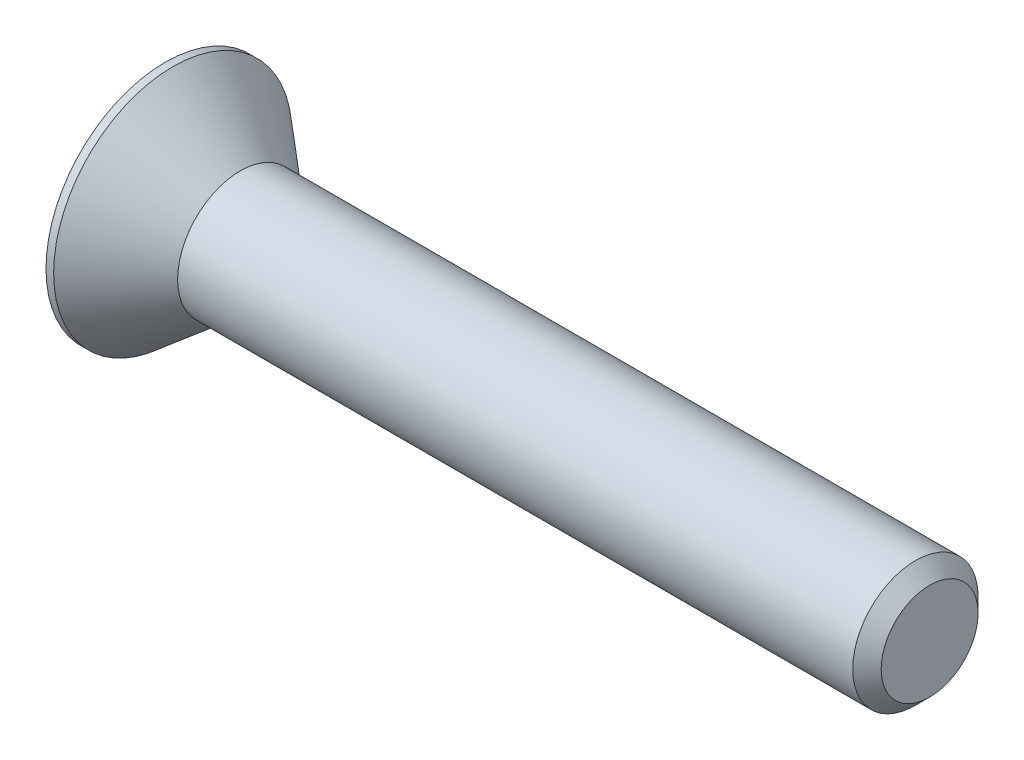
ISO-10303-21;
HEADER;
FILE_DESCRIPTION(('STEP AP214'),'2;1');
FILE_NAME('part.step','',(''),(''),'','','');
FILE_SCHEMA(('AUTOMOTIVE_DESIGN { 1 0 10303 214 1 1 1 1 }'));
ENDSEC;
DATA;
#1=APPLICATION_CONTEXT('core data for automotive mechanical design processes');
#2=APPLICATION_PROTOCOL_DEFINITION('international standard','automotive_design',2000,#1);
#3=PRODUCT_CONTEXT('',#1,'mechanical');
#4=PRODUCT('Part','Part','',(#3));
#5=PRODUCT_RELATED_PRODUCT_CATEGORY('part','',(#4));
#6=PRODUCT_DEFINITION_FORMATION('','',#4);
#7=PRODUCT_DEFINITION_CONTEXT('part definition',#1,'design');
#8=PRODUCT_DEFINITION('design','',#6,#7);
#9=PRODUCT_DEFINITION_SHAPE('','',#8);
#10=(LENGTH_UNIT() NAMED_UNIT(*) SI_UNIT(.MILLI.,.METRE.));
#11=(NAMED_UNIT(*) PLANE_ANGLE_UNIT() SI_UNIT($,.RADIAN.));
#12=(NAMED_UNIT(*) SI_UNIT($,.STERADIAN.) SOLID_ANGLE_UNIT());
#13=UNCERTAINTY_MEASURE_WITH_UNIT(LENGTH_MEASURE(1.E-05),#10,'distance_accuracy_value','');
#14=(GEOMETRIC_REPRESENTATION_CONTEXT(3) GLOBAL_UNCERTAINTY_ASSIGNED_CONTEXT((#13)) GLOBAL_UNIT_ASSIGNED_CONTEXT((#10,
#11,#12)) REPRESENTATION_CONTEXT('',''));
#15=CARTESIAN_POINT('',(0.,0.,0.));
#16=DIRECTION('',(0.,0.,1.));
#17=DIRECTION('',(1.,0.,0.));
#18=AXIS2_PLACEMENT_3D('',#15,#16,#17);
#19=CARTESIAN_POINT('',(-1.65136592745077,0.,2.3114));
#20=DIRECTION('',(0.,0.,1.));
#21=DIRECTION('',(1.,0.,0.));
#22=AXIS2_PLACEMENT_3D('',#19,#20,#21);
#23=PLANE('',#22);
#24=DIRECTION('',(1.,0.,0.));
#25=VECTOR('',#24,1.);
#26=CARTESIAN_POINT('',(-1.65136592745077,-0.381,2.3114));
#27=LINE('',#26,#25);
#28=CARTESIAN_POINT('',(-2.54,-0.381,2.3114));
#29=VERTEX_POINT('',#28);
#30=CARTESIAN_POINT('',(-0.76273185490154,-0.381,2.3114));
#31=VERTEX_POINT('',#30);
#32=EDGE_CURVE('E121',#29,#31,#27,.T.);
#33=ORIENTED_EDGE('',*,*,#32,.F.);
#34=DIRECTION('',(0.,1.,0.));
#35=VECTOR('',#34,1.);
#36=CARTESIAN_POINT('',(-2.54,0.,2.3114));
#37=LINE('',#36,#35);
#38=CARTESIAN_POINT('',(-2.54,0.381,2.3114));
#39=VERTEX_POINT('',#38);
#40=EDGE_CURVE('E118',#39,#29,#37,.F.);
#41=ORIENTED_EDGE('',*,*,#40,.F.);
#42=DIRECTION('',(1.,0.,0.));
#43=VECTOR('',#42,1.);
#44=CARTESIAN_POINT('',(-1.65136592745077,0.381,2.3114));
#45=LINE('',#44,#43);
#46=CARTESIAN_POINT('',(-0.76273185490154,0.381,2.3114));
#47=VERTEX_POINT('',#46);
#48=EDGE_CURVE('E117',#47,#39,#45,.F.);
#49=ORIENTED_EDGE('',*,*,#48,.F.);
#50=DIRECTION('',(0.,1.,0.));
#51=VECTOR('',#50,1.);
#52=CARTESIAN_POINT('',(-0.76273185490154,0.,2.3114));
#53=LINE('',#52,#51);
#54=EDGE_CURVE('E103',#31,#47,#53,.T.);
#55=ORIENTED_EDGE('',*,*,#54,.F.);
#56=EDGE_LOOP('',(#33,#41,#49,#55));
#57=FACE_BOUND('',#56,.T.);
#58=ADVANCED_FACE('F16',(#57),#23,.F.);
#59=CARTESIAN_POINT('',(-1.65136592745077,-2.3114,0.));
#60=DIRECTION('',(0.,1.,0.));
#61=DIRECTION('',(0.,0.,1.));
#62=AXIS2_PLACEMENT_3D('',#59,#60,#61);
#63=PLANE('',#62);
#64=DIRECTION('',(0.,0.,1.));
#65=VECTOR('',#64,1.);
#66=CARTESIAN_POINT('',(-0.76273185490154,-2.3114,0.));
#67=LINE('',#66,#65);
#68=CARTESIAN_POINT('',(-0.76273185490154,-2.3114,-0.381));
#69=VERTEX_POINT('',#68);
#70=CARTESIAN_POINT('',(-0.76273185490154,-2.3114,0.381));
#71=VERTEX_POINT('',#70);
#72=EDGE_CURVE('E114',#69,#71,#67,.T.);
#73=ORIENTED_EDGE('',*,*,#72,.F.);
#74=DIRECTION('',(1.,0.,0.));
#75=VECTOR('',#74,1.);
#76=CARTESIAN_POINT('',(-1.65136592745077,-2.3114,-0.381));
#77=LINE('',#76,#75);
#78=CARTESIAN_POINT('',(-2.54,-2.3114,-0.381));
#79=VERTEX_POINT('',#78);
#80=EDGE_CURVE('E209',#79,#69,#77,.T.);
#81=ORIENTED_EDGE('',*,*,#80,.F.);
#82=DIRECTION('',(0.,0.,1.));
#83=VECTOR('',#82,1.);
#84=CARTESIAN_POINT('',(-2.54,-2.3114,0.));
#85=LINE('',#84,#83);
#86=CARTESIAN_POINT('',(-2.54,-2.3114,0.381));
#87=VERTEX_POINT('',#86);
#88=EDGE_CURVE('E139',#79,#87,#85,.T.);
#89=ORIENTED_EDGE('',*,*,#88,.T.);
#90=DIRECTION('',(1.,0.,0.));
#91=VECTOR('',#90,1.);
#92=CARTESIAN_POINT('',(-1.65136592745077,-2.3114,0.381));
#93=LINE('',#92,#91);
#94=EDGE_CURVE('E216',#87,#71,#93,.T.);
#95=ORIENTED_EDGE('',*,*,#94,.T.);
#96=EDGE_LOOP('',(#73,#81,#89,#95));
#97=FACE_BOUND('',#96,.T.);
#98=ADVANCED_FACE('F255',(#97),#63,.T.);
#99=CARTESIAN_POINT('',(-1.65136592745077,0.,-2.3114));
#100=DIRECTION('',(0.,0.,1.));
#101=DIRECTION('',(1.,0.,0.));
#102=AXIS2_PLACEMENT_3D('',#99,#100,#101);
#103=PLANE('',#102);
#104=DIRECTION('',(0.,1.,0.));
#105=VECTOR('',#104,1.);
#106=CARTESIAN_POINT('',(-2.54,0.,-2.3114));
#107=LINE('',#106,#105);
#108=CARTESIAN_POINT('',(-2.54,0.381,-2.3114));
#109=VERTEX_POINT('',#108);
#110=CARTESIAN_POINT('',(-2.54,-0.381,-2.3114));
#111=VERTEX_POINT('',#110);
#112=EDGE_CURVE('E137',#109,#111,#107,.F.);
#113=ORIENTED_EDGE('',*,*,#112,.T.);
#114=DIRECTION('',(1.,0.,0.));
#115=VECTOR('',#114,1.);
#116=CARTESIAN_POINT('',(-1.65136592745077,-0.381,-2.3114));
#117=LINE('',#116,#115);
#118=CARTESIAN_POINT('',(-0.76273185490154,-0.381,-2.3114));
#119=VERTEX_POINT('',#118);
#120=EDGE_CURVE('E198',#119,#111,#117,.F.);
#121=ORIENTED_EDGE('',*,*,#120,.F.);
#122=DIRECTION('',(0.,1.,0.));
#123=VECTOR('',#122,1.);
#124=CARTESIAN_POINT('',(-0.76273185490154,0.,-2.3114));
#125=LINE('',#124,#123);
#126=CARTESIAN_POINT('',(-0.76273185490154,0.381,-2.3114));
#127=VERTEX_POINT('',#126);
#128=EDGE_CURVE('E135',#127,#119,#125,.F.);
#129=ORIENTED_EDGE('',*,*,#128,.F.);
#130=DIRECTION('',(1.,0.,0.));
#131=VECTOR('',#130,1.);
#132=CARTESIAN_POINT('',(-1.65136592745077,0.381,-2.3114));
#133=LINE('',#132,#131);
#134=EDGE_CURVE('E195',#109,#127,#133,.T.);
#135=ORIENTED_EDGE('',*,*,#134,.F.);
#136=EDGE_LOOP('',(#113,#121,#129,#135));
#137=FACE_BOUND('',#136,.T.);
#138=ADVANCED_FACE('F244',(#137),#103,.T.);
#139=CARTESIAN_POINT('',(-0.76273185490154,0.,0.));
#140=DIRECTION('',(-1.,0.,0.));
#141=DIRECTION('',(0.,0.,1.));
#142=AXIS2_PLACEMENT_3D('',#139,#140,#141);
#143=PLANE('',#142);
#144=ORIENTED_EDGE('',*,*,#54,.T.);
#145=DIRECTION('',(0.,0.,-1.));
#146=VECTOR('',#145,1.);
#147=CARTESIAN_POINT('',(-0.76273185490154,0.381,0.));
#148=LINE('',#147,#146);
#149=CARTESIAN_POINT('',(-0.76273185490154,0.381,0.381));
#150=VERTEX_POINT('',#149);
#151=EDGE_CURVE('E108',#150,#47,#148,.F.);
#152=ORIENTED_EDGE('',*,*,#151,.F.);
#153=DIRECTION('',(0.,1.,0.));
#154=VECTOR('',#153,1.);
#155=CARTESIAN_POINT('',(-0.76273185490154,0.,0.381));
#156=LINE('',#155,#154);
#157=CARTESIAN_POINT('',(-0.76273185490154,2.3114,0.381));
#158=VERTEX_POINT('',#157);
#159=EDGE_CURVE('E182',#150,#158,#156,.T.);
#160=ORIENTED_EDGE('',*,*,#159,.T.);
#161=DIRECTION('',(0.,0.,-1.));
#162=VECTOR('',#161,1.);
#163=CARTESIAN_POINT('',(-0.76273185490154,2.3114,0.));
#164=LINE('',#163,#162);
#165=CARTESIAN_POINT('',(-0.76273185490154,2.3114,-0.381));
#166=VERTEX_POINT('',#165);
#167=EDGE_CURVE('E113',#166,#158,#164,.F.);
#168=ORIENTED_EDGE('',*,*,#167,.F.);
#169=DIRECTION('',(0.,1.,0.));
#170=VECTOR('',#169,1.);
#171=CARTESIAN_POINT('',(-0.76273185490154,0.,-0.381));
#172=LINE('',#171,#170);
#173=CARTESIAN_POINT('',(-0.76273185490154,0.381,-0.381));
#174=VERTEX_POINT('',#173);
#175=EDGE_CURVE('E187',#174,#166,#172,.T.);
#176=ORIENTED_EDGE('',*,*,#175,.F.);
#177=DIRECTION('',(0.,0.,-1.));
#178=VECTOR('',#177,1.);
#179=CARTESIAN_POINT('',(-0.76273185490154,0.381,0.));
#180=LINE('',#179,#178);
#181=EDGE_CURVE('E193',#127,#174,#180,.F.);
#182=ORIENTED_EDGE('',*,*,#181,.F.);
#183=ORIENTED_EDGE('',*,*,#128,.T.);
#184=DIRECTION('',(0.,0.,1.));
#185=VECTOR('',#184,1.);
#186=CARTESIAN_POINT('',(-0.76273185490154,-0.381,0.));
#187=LINE('',#186,#185);
#188=CARTESIAN_POINT('',(-0.76273185490154,-0.381,-0.381));
#189=VERTEX_POINT('',#188);
#190=EDGE_CURVE('E201',#189,#119,#187,.F.);
#191=ORIENTED_EDGE('',*,*,#190,.F.);
#192=DIRECTION('',(0.,1.,0.));
#193=VECTOR('',#192,1.);
#194=CARTESIAN_POINT('',(-0.76273185490154,0.,-0.381));
#195=LINE('',#194,#193);
#196=EDGE_CURVE('E207',#69,#189,#195,.T.);
#197=ORIENTED_EDGE('',*,*,#196,.F.);
#198=ORIENTED_EDGE('',*,*,#72,.T.);
#199=DIRECTION('',(0.,1.,0.));
#200=VECTOR('',#199,1.);
#201=CARTESIAN_POINT('',(-0.76273185490154,0.,0.381));
#202=LINE('',#201,#200);
#203=CARTESIAN_POINT('',(-0.76273185490154,-0.381,0.381));
#204=VERTEX_POINT('',#203);
#205=EDGE_CURVE('E214',#71,#204,#202,.T.);
#206=ORIENTED_EDGE('',*,*,#205,.T.);
#207=DIRECTION('',(0.,0.,1.));
#208=VECTOR('',#207,1.);
#209=CARTESIAN_POINT('',(-0.76273185490154,-0.381,0.));
#210=LINE('',#209,#208);
#211=EDGE_CURVE('E111',#31,#204,#210,.F.);
#212=ORIENTED_EDGE('',*,*,#211,.F.);
#213=EDGE_LOOP('',(#144,#152,#160,#168,#176,#182,#183,#191,#197,#198,#206,#212));
#214=FACE_BOUND('',#213,.T.);
#215=ADVANCED_FACE('F106',(#214),#143,.T.);
#216=CARTESIAN_POINT('',(-1.65136592745077,2.3114,0.));
#217=DIRECTION('',(0.,-1.,0.));
#218=DIRECTION('',(0.,0.,-1.));
#219=AXIS2_PLACEMENT_3D('',#216,#217,#218);
#220=PLANE('',#219);
#221=DIRECTION('',(0.,0.,-1.));
#222=VECTOR('',#221,1.);
#223=CARTESIAN_POINT('',(-2.54,2.3114,0.));
#224=LINE('',#223,#222);
#225=CARTESIAN_POINT('',(-2.54,2.3114,0.381));
#226=VERTEX_POINT('',#225);
#227=CARTESIAN_POINT('',(-2.54,2.3114,-0.381));
#228=VERTEX_POINT('',#227);
#229=EDGE_CURVE('E34',#226,#228,#224,.T.);
#230=ORIENTED_EDGE('',*,*,#229,.T.);
#231=DIRECTION('',(1.,0.,0.));
#232=VECTOR('',#231,1.);
#233=CARTESIAN_POINT('',(-1.65136592745077,2.3114,-0.381));
#234=LINE('',#233,#232);
#235=EDGE_CURVE('E184',#166,#228,#234,.F.);
#236=ORIENTED_EDGE('',*,*,#235,.F.);
#237=ORIENTED_EDGE('',*,*,#167,.T.);
#238=DIRECTION('',(1.,0.,0.));
#239=VECTOR('',#238,1.);
#240=CARTESIAN_POINT('',(-1.65136592745077,2.3114,0.381));
#241=LINE('',#240,#239);
#242=EDGE_CURVE('E180',#158,#226,#241,.F.);
#243=ORIENTED_EDGE('',*,*,#242,.T.);
#244=EDGE_LOOP('',(#230,#236,#237,#243));
#245=FACE_BOUND('',#244,.T.);
#246=ADVANCED_FACE('F232',(#245),#220,.T.);
#247=CARTESIAN_POINT('',(-1.65136592745077,0.381,0.));
#248=DIRECTION('',(0.,-1.,0.));
#249=DIRECTION('',(0.,0.,-1.));
#250=AXIS2_PLACEMENT_3D('',#247,#248,#249);
#251=PLANE('',#250);
#252=ORIENTED_EDGE('',*,*,#48,.T.);
#253=DIRECTION('',(0.,0.,1.));
#254=VECTOR('',#253,1.);
#255=CARTESIAN_POINT('',(-2.54,0.381,1.9812));
#256=LINE('',#255,#254);
#257=CARTESIAN_POINT('',(-2.54,0.381,0.381));
#258=VERTEX_POINT('',#257);
#259=EDGE_CURVE('E177',#258,#39,#256,.T.);
#260=ORIENTED_EDGE('',*,*,#259,.F.);
#261=DIRECTION('',(1.,0.,0.));
#262=VECTOR('',#261,1.);
#263=CARTESIAN_POINT('',(-1.65136592745077,0.381,0.381));
#264=LINE('',#263,#262);
#265=EDGE_CURVE('E125',#258,#150,#264,.T.);
#266=ORIENTED_EDGE('',*,*,#265,.T.);
#267=ORIENTED_EDGE('',*,*,#151,.T.);
#268=EDGE_LOOP('',(#252,#260,#266,#267));
#269=FACE_BOUND('',#268,.T.);
#270=ADVANCED_FACE('F123',(#269),#251,.T.);
#271=CARTESIAN_POINT('',(-1.65136592745077,-0.381,0.));
#272=DIRECTION('',(0.,1.,0.));
#273=DIRECTION('',(0.,0.,1.));
#274=AXIS2_PLACEMENT_3D('',#271,#272,#273);
#275=PLANE('',#274);
#276=ORIENTED_EDGE('',*,*,#32,.T.);
#277=ORIENTED_EDGE('',*,*,#211,.T.);
#278=DIRECTION('',(1.,0.,0.));
#279=VECTOR('',#278,1.);
#280=CARTESIAN_POINT('',(-1.65136592745077,-0.381,0.381));
#281=LINE('',#280,#279);
#282=CARTESIAN_POINT('',(-2.54,-0.381,0.381));
#283=VERTEX_POINT('',#282);
#284=EDGE_CURVE('E212',#204,#283,#281,.F.);
#285=ORIENTED_EDGE('',*,*,#284,.T.);
#286=DIRECTION('',(0.,0.,1.));
#287=VECTOR('',#286,1.);
#288=CARTESIAN_POINT('',(-2.54,-0.381,1.9812));
#289=LINE('',#288,#287);
#290=EDGE_CURVE('E174',#29,#283,#289,.F.);
#291=ORIENTED_EDGE('',*,*,#290,.F.);
#292=EDGE_LOOP('',(#276,#277,#285,#291));
#293=FACE_BOUND('',#292,.T.);
#294=ADVANCED_FACE('F220',(#293),#275,.T.);
#295=CARTESIAN_POINT('',(-1.65136592745077,0.,0.381));
#296=DIRECTION('',(0.,0.,1.));
#297=DIRECTION('',(1.,0.,0.));
#298=AXIS2_PLACEMENT_3D('',#295,#296,#297);
#299=PLANE('',#298);
#300=ORIENTED_EDGE('',*,*,#205,.F.);
#301=ORIENTED_EDGE('',*,*,#94,.F.);
#302=DIRECTION('',(0.,1.,0.));
#303=VECTOR('',#302,1.);
#304=CARTESIAN_POINT('',(-2.54,0.,0.381));
#305=LINE('',#304,#303);
#306=EDGE_CURVE('E171',#283,#87,#305,.F.);
#307=ORIENTED_EDGE('',*,*,#306,.F.);
#308=ORIENTED_EDGE('',*,*,#284,.F.);
#309=EDGE_LOOP('',(#300,#301,#307,#308));
#310=FACE_BOUND('',#309,.T.);
#311=ADVANCED_FACE('F258',(#310),#299,.F.);
#312=CARTESIAN_POINT('',(-1.65136592745077,0.,-0.381));
#313=DIRECTION('',(0.,0.,1.));
#314=DIRECTION('',(1.,0.,0.));
#315=AXIS2_PLACEMENT_3D('',#312,#313,#314);
#316=PLANE('',#315);
#317=ORIENTED_EDGE('',*,*,#80,.T.);
#318=ORIENTED_EDGE('',*,*,#196,.T.);
#319=DIRECTION('',(1.,0.,0.));
#320=VECTOR('',#319,1.);
#321=CARTESIAN_POINT('',(-1.65136592745077,-0.381,-0.381));
#322=LINE('',#321,#320);
#323=CARTESIAN_POINT('',(-2.54,-0.381,-0.381));
#324=VERTEX_POINT('',#323);
#325=EDGE_CURVE('E204',#324,#189,#322,.T.);
#326=ORIENTED_EDGE('',*,*,#325,.F.);
#327=DIRECTION('',(0.,1.,0.));
#328=VECTOR('',#327,1.);
#329=CARTESIAN_POINT('',(-2.54,0.,-0.381));
#330=LINE('',#329,#328);
#331=EDGE_CURVE('E168',#79,#324,#330,.T.);
#332=ORIENTED_EDGE('',*,*,#331,.F.);
#333=EDGE_LOOP('',(#317,#318,#326,#332));
#334=FACE_BOUND('',#333,.T.);
#335=ADVANCED_FACE('F253',(#334),#316,.T.);
#336=CARTESIAN_POINT('',(-1.65136592745077,-0.381,0.));
#337=DIRECTION('',(0.,1.,0.));
#338=DIRECTION('',(0.,0.,1.));
#339=AXIS2_PLACEMENT_3D('',#336,#337,#338);
#340=PLANE('',#339);
#341=ORIENTED_EDGE('',*,*,#120,.T.);
#342=DIRECTION('',(0.,0.,1.));
#343=VECTOR('',#342,1.);
#344=CARTESIAN_POINT('',(-2.54,-0.381,1.9812));
#345=LINE('',#344,#343);
#346=EDGE_CURVE('E165',#324,#111,#345,.F.);
#347=ORIENTED_EDGE('',*,*,#346,.F.);
#348=ORIENTED_EDGE('',*,*,#325,.T.);
#349=ORIENTED_EDGE('',*,*,#190,.T.);
#350=EDGE_LOOP('',(#341,#347,#348,#349));
#351=FACE_BOUND('',#350,.T.);
#352=ADVANCED_FACE('F247',(#351),#340,.T.);
#353=CARTESIAN_POINT('',(-1.65136592745077,0.381,0.));
#354=DIRECTION('',(0.,-1.,0.));
#355=DIRECTION('',(0.,0.,-1.));
#356=AXIS2_PLACEMENT_3D('',#353,#354,#355);
#357=PLANE('',#356);
#358=ORIENTED_EDGE('',*,*,#134,.T.);
#359=ORIENTED_EDGE('',*,*,#181,.T.);
#360=DIRECTION('',(1.,0.,0.));
#361=VECTOR('',#360,1.);
#362=CARTESIAN_POINT('',(-1.65136592745077,0.381,-0.381));
#363=LINE('',#362,#361);
#364=CARTESIAN_POINT('',(-2.54,0.381,-0.381));
#365=VERTEX_POINT('',#364);
#366=EDGE_CURVE('E190',#365,#174,#363,.T.);
#367=ORIENTED_EDGE('',*,*,#366,.F.);
#368=DIRECTION('',(0.,0.,1.));
#369=VECTOR('',#368,1.);
#370=CARTESIAN_POINT('',(-2.54,0.381,1.9812));
#371=LINE('',#370,#369);
#372=EDGE_CURVE('E162',#109,#365,#371,.T.);
#373=ORIENTED_EDGE('',*,*,#372,.F.);
#374=EDGE_LOOP('',(#358,#359,#367,#373));
#375=FACE_BOUND('',#374,.T.);
#376=ADVANCED_FACE('F242',(#375),#357,.T.);
#377=CARTESIAN_POINT('',(-1.65136592745077,0.,-0.381));
#378=DIRECTION('',(0.,0.,1.));
#379=DIRECTION('',(1.,0.,0.));
#380=AXIS2_PLACEMENT_3D('',#377,#378,#379);
#381=PLANE('',#380);
#382=ORIENTED_EDGE('',*,*,#235,.T.);
#383=DIRECTION('',(0.,1.,0.));
#384=VECTOR('',#383,1.);
#385=CARTESIAN_POINT('',(-2.54,0.,-0.381));
#386=LINE('',#385,#384);
#387=EDGE_CURVE('E160',#365,#228,#386,.T.);
#388=ORIENTED_EDGE('',*,*,#387,.F.);
#389=ORIENTED_EDGE('',*,*,#366,.T.);
#390=ORIENTED_EDGE('',*,*,#175,.T.);
#391=EDGE_LOOP('',(#382,#388,#389,#390));
#392=FACE_BOUND('',#391,.T.);
#393=ADVANCED_FACE('F235',(#392),#381,.T.);
#394=CARTESIAN_POINT('',(-1.65136592745077,0.,0.381));
#395=DIRECTION('',(0.,0.,1.));
#396=DIRECTION('',(1.,0.,0.));
#397=AXIS2_PLACEMENT_3D('',#394,#395,#396);
#398=PLANE('',#397);
#399=DIRECTION('',(0.,1.,0.));
#400=VECTOR('',#399,1.);
#401=CARTESIAN_POINT('',(-2.54,0.,0.381));
#402=LINE('',#401,#400);
#403=EDGE_CURVE('E153',#226,#258,#402,.F.);
#404=ORIENTED_EDGE('',*,*,#403,.F.);
#405=ORIENTED_EDGE('',*,*,#242,.F.);
#406=ORIENTED_EDGE('',*,*,#159,.F.);
#407=ORIENTED_EDGE('',*,*,#265,.F.);
#408=EDGE_LOOP('',(#404,#405,#406,#407));
#409=FACE_BOUND('',#408,.T.);
#410=ADVANCED_FACE('F227',(#409),#398,.F.);
#411=CARTESIAN_POINT('',(-2.54,0.,1.9812));
#412=DIRECTION('',(-1.,0.,0.));
#413=DIRECTION('',(0.,0.,1.));
#414=AXIS2_PLACEMENT_3D('',#411,#412,#413);
#415=PLANE('',#414);
#416=ORIENTED_EDGE('',*,*,#229,.F.);
#417=ORIENTED_EDGE('',*,*,#403,.T.);
#418=ORIENTED_EDGE('',*,*,#259,.T.);
#419=ORIENTED_EDGE('',*,*,#40,.T.);
#420=ORIENTED_EDGE('',*,*,#290,.T.);
#421=ORIENTED_EDGE('',*,*,#306,.T.);
#422=ORIENTED_EDGE('',*,*,#88,.F.);
#423=ORIENTED_EDGE('',*,*,#331,.T.);
#424=ORIENTED_EDGE('',*,*,#346,.T.);
#425=ORIENTED_EDGE('',*,*,#112,.F.);
#426=ORIENTED_EDGE('',*,*,#372,.T.);
#427=ORIENTED_EDGE('',*,*,#387,.T.);
#428=EDGE_LOOP('',(#416,#417,#418,#419,#420,#421,#422,#423,#424,#425,#426,#427));
#429=FACE_BOUND('',#428,.T.);
#430=CARTESIAN_POINT('',(-2.54,0.,0.));
#431=DIRECTION('',(1.,0.,0.));
#432=DIRECTION('',(0.,0.,-1.));
#433=AXIS2_PLACEMENT_3D('',#430,#431,#432);
#434=CIRCLE('',#433,3.9624);
#435=CARTESIAN_POINT('',(-2.54,0.,-3.9624));
#436=VERTEX_POINT('',#435);
#437=EDGE_CURVE('E19',#436,#436,#434,.T.);
#438=ORIENTED_EDGE('',*,*,#437,.F.);
#439=EDGE_LOOP('',(#438));
#440=FACE_BOUND('',#439,.T.);
#441=ADVANCED_FACE('F223',(#429,#440),#415,.T.);
#442=CARTESIAN_POINT('',(-2.413,0.,0.));
#443=DIRECTION('',(1.,0.,0.));
#444=DIRECTION('',(0.,0.,-1.));
#445=AXIS2_PLACEMENT_3D('',#442,#443,#444);
#446=CYLINDRICAL_SURFACE('',#445,3.9624);
#447=ORIENTED_EDGE('',*,*,#437,.T.);
#448=EDGE_LOOP('',(#447));
#449=FACE_BOUND('',#448,.T.);
#450=CARTESIAN_POINT('',(-2.28599999991275,0.,0.));
#451=DIRECTION('',(-1.,0.,0.));
#452=DIRECTION('',(0.,0.,1.));
#453=AXIS2_PLACEMENT_3D('',#450,#451,#452);
#454=CIRCLE('',#453,3.96240000003445);
#455=CARTESIAN_POINT('',(-2.28599999991275,0.,3.96240000003445));
#456=VERTEX_POINT('',#455);
#457=EDGE_CURVE('E143',#456,#456,#454,.F.);
#458=ORIENTED_EDGE('',*,*,#457,.F.);
#459=EDGE_LOOP('',(#458));
#460=FACE_BOUND('',#459,.T.);
#461=ADVANCED_FACE('F286',(#449,#460),#446,.T.);
#462=CARTESIAN_POINT('',(22.86,0.,-1.0414));
#463=DIRECTION('',(1.,0.,0.));
#464=DIRECTION('',(0.,0.,-1.));
#465=AXIS2_PLACEMENT_3D('',#462,#463,#464);
#466=PLANE('',#465);
#467=CARTESIAN_POINT('',(22.8599999999801,0.,0.));
#468=DIRECTION('',(-1.,0.,0.));
#469=DIRECTION('',(0.,0.,1.));
#470=AXIS2_PLACEMENT_3D('',#467,#468,#469);
#471=CIRCLE('',#470,1.61036000002923);
#472=CARTESIAN_POINT('',(22.8599999999801,0.,1.61036000002923));
#473=VERTEX_POINT('',#472);
#474=EDGE_CURVE('E141',#473,#473,#471,.T.);
#475=ORIENTED_EDGE('',*,*,#474,.F.);
#476=EDGE_LOOP('',(#475));
#477=FACE_BOUND('',#476,.T.);
#478=ADVANCED_FACE('F282',(#477),#466,.T.);
#479=CARTESIAN_POINT('',(-2.2859999998559,0.,0.));
#480=DIRECTION('',(-1.,0.,0.));
#481=DIRECTION('',(0.,0.,1.));
#482=AXIS2_PLACEMENT_3D('',#479,#480,#481);
#483=CONICAL_SURFACE('',#482,3.96239999992076,0.698131700784918);
#484=CARTESIAN_POINT('',(-0.0459799473598605,0.,0.));
#485=DIRECTION('',(-1.,0.,0.));
#486=DIRECTION('',(0.,0.,1.));
#487=AXIS2_PLACEMENT_3D('',#484,#485,#486);
#488=CIRCLE('',#487,2.0828);
#489=CARTESIAN_POINT('',(-0.0459799473598605,0.,2.0828));
#490=VERTEX_POINT('',#489);
#491=EDGE_CURVE('E25',#490,#490,#488,.F.);
#492=ORIENTED_EDGE('',*,*,#491,.F.);
#493=EDGE_LOOP('',(#492));
#494=FACE_BOUND('',#493,.T.);
#495=ORIENTED_EDGE('',*,*,#457,.T.);
#496=EDGE_LOOP('',(#495));
#497=FACE_BOUND('',#496,.T.);
#498=ADVANCED_FACE('F276',(#494,#497),#483,.T.);
#499=CARTESIAN_POINT('',(22.387560000027,0.,0.));
#500=DIRECTION('',(-1.,0.,0.));
#501=DIRECTION('',(0.,0.,1.));
#502=AXIS2_PLACEMENT_3D('',#499,#500,#501);
#503=CONICAL_SURFACE('',#502,2.0827999999824,0.785398163397448);
#504=ORIENTED_EDGE('',*,*,#474,.T.);
#505=EDGE_LOOP('',(#504));
#506=FACE_BOUND('',#505,.T.);
#507=CARTESIAN_POINT('',(22.38756,0.,0.));
#508=DIRECTION('',(-1.,0.,0.));
#509=DIRECTION('',(0.,0.,1.));
#510=AXIS2_PLACEMENT_3D('',#507,#508,#509);
#511=CIRCLE('',#510,2.0828);
#512=CARTESIAN_POINT('',(22.38756,0.,2.0828));
#513=VERTEX_POINT('',#512);
#514=EDGE_CURVE('E11',#513,#513,#511,.T.);
#515=ORIENTED_EDGE('',*,*,#514,.F.);
#516=EDGE_LOOP('',(#515));
#517=FACE_BOUND('',#516,.T.);
#518=ADVANCED_FACE('F270',(#506,#517),#503,.T.);
#519=CARTESIAN_POINT('',(11.43,0.,0.));
#520=DIRECTION('',(-1.,0.,0.));
#521=DIRECTION('',(0.,0.,1.));
#522=AXIS2_PLACEMENT_3D('',#519,#520,#521);
#523=CYLINDRICAL_SURFACE('',#522,2.0828);
#524=ORIENTED_EDGE('',*,*,#514,.T.);
#525=EDGE_LOOP('',(#524));
#526=FACE_BOUND('',#525,.T.);
#527=ORIENTED_EDGE('',*,*,#491,.T.);
#528=EDGE_LOOP('',(#527));
#529=FACE_BOUND('',#528,.T.);
#530=ADVANCED_FACE('F268',(#526,#529),#523,.T.);
#531=CLOSED_SHELL('',(#58,#98,#138,#215,#246,#270,#294,#311,#335,#352,#376,#393,#410,#441,#461,
#478,#498,#518,#530));
#532=MANIFOLD_SOLID_BREP('B1',#531);
#533=ADVANCED_BREP_SHAPE_REPRESENTATION('',(#18,#532),#14);
#534=SHAPE_DEFINITION_REPRESENTATION(#9,#533);
ENDSEC;
END-ISO-10303-21;
